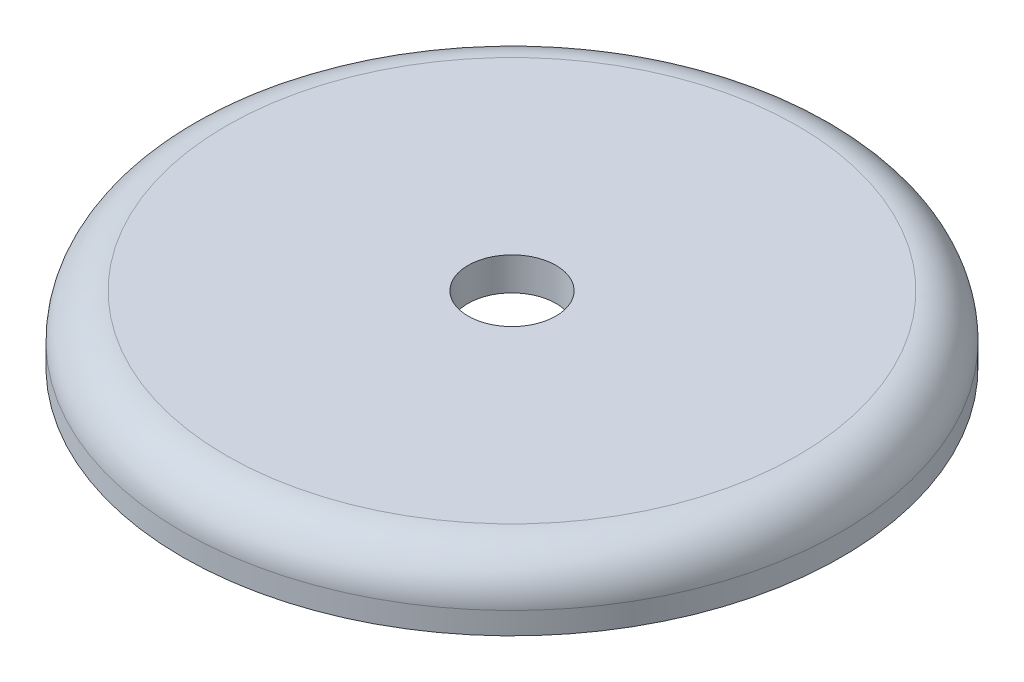
ISO-10303-21;
HEADER;
FILE_DESCRIPTION(('STEP AP214'),'2;1');
FILE_NAME('part.step','',(''),(''),'','','');
FILE_SCHEMA(('AUTOMOTIVE_DESIGN { 1 0 10303 214 1 1 1 1 }'));
ENDSEC;
DATA;
#1=APPLICATION_CONTEXT('core data for automotive mechanical design processes');
#2=APPLICATION_PROTOCOL_DEFINITION('international standard','automotive_design',2000,#1);
#3=PRODUCT_CONTEXT('',#1,'mechanical');
#4=PRODUCT('Part','Part','',(#3));
#5=PRODUCT_RELATED_PRODUCT_CATEGORY('part','',(#4));
#6=PRODUCT_DEFINITION_FORMATION('','',#4);
#7=PRODUCT_DEFINITION_CONTEXT('part definition',#1,'design');
#8=PRODUCT_DEFINITION('design','',#6,#7);
#9=PRODUCT_DEFINITION_SHAPE('','',#8);
#10=(LENGTH_UNIT() NAMED_UNIT(*) SI_UNIT(.MILLI.,.METRE.));
#11=(NAMED_UNIT(*) PLANE_ANGLE_UNIT() SI_UNIT($,.RADIAN.));
#12=(NAMED_UNIT(*) SI_UNIT($,.STERADIAN.) SOLID_ANGLE_UNIT());
#13=UNCERTAINTY_MEASURE_WITH_UNIT(LENGTH_MEASURE(1.E-05),#10,'distance_accuracy_value','');
#14=(GEOMETRIC_REPRESENTATION_CONTEXT(3) GLOBAL_UNCERTAINTY_ASSIGNED_CONTEXT((#13)) GLOBAL_UNIT_ASSIGNED_CONTEXT((#10,
#11,#12)) REPRESENTATION_CONTEXT('',''));
#15=CARTESIAN_POINT('',(0.,0.,0.));
#16=DIRECTION('',(0.,0.,1.));
#17=DIRECTION('',(1.,0.,0.));
#18=AXIS2_PLACEMENT_3D('',#15,#16,#17);
#19=CARTESIAN_POINT('',(0.,0.,0.));
#20=DIRECTION('',(0.,-1.,0.));
#21=DIRECTION('',(0.,0.,-1.));
#22=AXIS2_PLACEMENT_3D('',#19,#20,#21);
#23=PLANE('',#22);
#24=CARTESIAN_POINT('',(0.410000000000039,0.,-10.9649999974753));
#25=DIRECTION('',(0.,-1.,0.));
#26=DIRECTION('',(0.,0.,-1.));
#27=AXIS2_PLACEMENT_3D('',#24,#25,#26);
#28=CIRCLE('',#27,2.59999999999999);
#29=CARTESIAN_POINT('',(0.410000000000039,0.,-13.5649999974753));
#30=VERTEX_POINT('',#29);
#31=EDGE_CURVE('E89',#30,#30,#28,.T.);
#32=ORIENTED_EDGE('',*,*,#31,.F.);
#33=EDGE_LOOP('',(#32));
#34=FACE_BOUND('',#33,.T.);
#35=CARTESIAN_POINT('',(0.820000000000032,0.,10.9650000025247));
#36=DIRECTION('',(0.,-1.,0.));
#37=DIRECTION('',(0.,0.,-1.));
#38=AXIS2_PLACEMENT_3D('',#35,#36,#37);
#39=CIRCLE('',#38,2.6);
#40=CARTESIAN_POINT('',(0.820000000000032,0.,8.3650000025247));
#41=VERTEX_POINT('',#40);
#42=EDGE_CURVE('E81',#41,#41,#39,.T.);
#43=ORIENTED_EDGE('',*,*,#42,.F.);
#44=EDGE_LOOP('',(#43));
#45=FACE_BOUND('',#44,.T.);
#46=CARTESIAN_POINT('',(0.,0.,0.));
#47=DIRECTION('',(0.,-1.,0.));
#48=DIRECTION('',(0.,0.,-1.));
#49=AXIS2_PLACEMENT_3D('',#46,#47,#48);
#50=CIRCLE('',#49,8.);
#51=CARTESIAN_POINT('',(0.,0.,-8.));
#52=VERTEX_POINT('',#51);
#53=EDGE_CURVE('E65',#52,#52,#50,.T.);
#54=ORIENTED_EDGE('',*,*,#53,.F.);
#55=EDGE_LOOP('',(#54));
#56=FACE_BOUND('',#55,.T.);
#57=CARTESIAN_POINT('',(0.,0.,0.));
#58=DIRECTION('',(0.,-1.,0.));
#59=DIRECTION('',(0.,0.,-1.));
#60=AXIS2_PLACEMENT_3D('',#57,#58,#59);
#61=CIRCLE('',#60,15.);
#62=CARTESIAN_POINT('',(0.,0.,-15.));
#63=VERTEX_POINT('',#62);
#64=EDGE_CURVE('E56',#63,#63,#61,.T.);
#65=ORIENTED_EDGE('',*,*,#64,.T.);
#66=EDGE_LOOP('',(#65));
#67=FACE_BOUND('',#66,.T.);
#68=ADVANCED_FACE('F42',(#34,#45,#56,#67),#23,.T.);
#69=CARTESIAN_POINT('',(0.,0.,0.));
#70=DIRECTION('',(0.,-1.,0.));
#71=DIRECTION('',(0.,0.,-1.));
#72=AXIS2_PLACEMENT_3D('',#69,#70,#71);
#73=CYLINDRICAL_SURFACE('',#72,15.);
#74=CARTESIAN_POINT('',(0.,1.,0.));
#75=DIRECTION('',(0.,1.,0.));
#76=DIRECTION('',(0.,0.,1.));
#77=AXIS2_PLACEMENT_3D('',#74,#75,#76);
#78=CIRCLE('',#77,15.);
#79=CARTESIAN_POINT('',(0.,1.,15.));
#80=VERTEX_POINT('',#79);
#81=EDGE_CURVE('E50',#80,#80,#78,.F.);
#82=ORIENTED_EDGE('',*,*,#81,.T.);
#83=EDGE_LOOP('',(#82));
#84=FACE_BOUND('',#83,.T.);
#85=ORIENTED_EDGE('',*,*,#64,.F.);
#86=EDGE_LOOP('',(#85));
#87=FACE_BOUND('',#86,.T.);
#88=ADVANCED_FACE('F109',(#84,#87),#73,.T.);
#89=CARTESIAN_POINT('',(15.,3.,0.));
#90=DIRECTION('',(0.,1.,0.));
#91=DIRECTION('',(0.,0.,1.));
#92=AXIS2_PLACEMENT_3D('',#89,#90,#91);
#93=PLANE('',#92);
#94=CARTESIAN_POINT('',(0.,3.,0.));
#95=DIRECTION('',(0.,1.,0.));
#96=DIRECTION('',(0.,0.,1.));
#97=AXIS2_PLACEMENT_3D('',#94,#95,#96);
#98=CIRCLE('',#97,13.);
#99=CARTESIAN_POINT('',(0.,3.,13.));
#100=VERTEX_POINT('',#99);
#101=EDGE_CURVE('E10',#100,#100,#98,.T.);
#102=ORIENTED_EDGE('',*,*,#101,.T.);
#103=EDGE_LOOP('',(#102));
#104=FACE_BOUND('',#103,.T.);
#105=CARTESIAN_POINT('',(0.,3.,0.));
#106=DIRECTION('',(0.,1.,0.));
#107=DIRECTION('',(0.,0.,1.));
#108=AXIS2_PLACEMENT_3D('',#105,#106,#107);
#109=CIRCLE('',#108,2.);
#110=CARTESIAN_POINT('',(0.,3.,-2.00000000000009));
#111=VERTEX_POINT('',#110);
#112=EDGE_CURVE('E69',#111,#111,#109,.F.);
#113=ORIENTED_EDGE('',*,*,#112,.T.);
#114=EDGE_LOOP('',(#113));
#115=FACE_BOUND('',#114,.T.);
#116=ADVANCED_FACE('F117',(#104,#115),#93,.T.);
#117=CARTESIAN_POINT('',(0.,1.5,0.));
#118=DIRECTION('',(0.,-1.,0.));
#119=DIRECTION('',(0.,0.,-1.));
#120=AXIS2_PLACEMENT_3D('',#117,#118,#119);
#121=CYLINDRICAL_SURFACE('',#120,8.);
#122=CARTESIAN_POINT('',(0.,1.5,0.));
#123=DIRECTION('',(0.,-1.,0.));
#124=DIRECTION('',(0.,0.,-1.));
#125=AXIS2_PLACEMENT_3D('',#122,#123,#124);
#126=CIRCLE('',#125,8.);
#127=CARTESIAN_POINT('',(0.,1.5,-8.));
#128=VERTEX_POINT('',#127);
#129=EDGE_CURVE('E62',#128,#128,#126,.T.);
#130=ORIENTED_EDGE('',*,*,#129,.F.);
#131=EDGE_LOOP('',(#130));
#132=FACE_BOUND('',#131,.T.);
#133=ORIENTED_EDGE('',*,*,#53,.T.);
#134=EDGE_LOOP('',(#133));
#135=FACE_BOUND('',#134,.T.);
#136=ADVANCED_FACE('F122',(#132,#135),#121,.F.);
#137=CARTESIAN_POINT('',(0.,1.5,0.));
#138=DIRECTION('',(0.,-1.,0.));
#139=DIRECTION('',(0.,0.,-1.));
#140=AXIS2_PLACEMENT_3D('',#137,#138,#139);
#141=PLANE('',#140);
#142=CARTESIAN_POINT('',(0.,1.5,0.));
#143=DIRECTION('',(0.,-1.,0.));
#144=DIRECTION('',(0.,0.,-1.));
#145=AXIS2_PLACEMENT_3D('',#142,#143,#144);
#146=CIRCLE('',#145,2.);
#147=CARTESIAN_POINT('',(0.,1.5,-2.00000000000009));
#148=VERTEX_POINT('',#147);
#149=EDGE_CURVE('E76',#148,#148,#146,.T.);
#150=ORIENTED_EDGE('',*,*,#149,.F.);
#151=EDGE_LOOP('',(#150));
#152=FACE_BOUND('',#151,.T.);
#153=ORIENTED_EDGE('',*,*,#129,.T.);
#154=EDGE_LOOP('',(#153));
#155=FACE_BOUND('',#154,.T.);
#156=ADVANCED_FACE('F127',(#152,#155),#141,.T.);
#157=CARTESIAN_POINT('',(0.,8.65685424949239,0.));
#158=DIRECTION('',(0.,-1.,0.));
#159=DIRECTION('',(0.,0.,-1.));
#160=AXIS2_PLACEMENT_3D('',#157,#158,#159);
#161=CYLINDRICAL_SURFACE('',#160,2.);
#162=CARTESIAN_POINT('',(0.,1.5,-2.00000000000009));
#163=CARTESIAN_POINT('',(0.,1.515625,-2.00000000000009));
#164=CARTESIAN_POINT('',(0.,1.53125,-2.00000000000009));
#165=CARTESIAN_POINT('',(0.,1.5625,-2.00000000000009));
#166=CARTESIAN_POINT('',(0.,1.578125,-2.00000000000009));
#167=CARTESIAN_POINT('',(0.,1.609375,-2.00000000000009));
#168=CARTESIAN_POINT('',(0.,1.625,-2.00000000000009));
#169=CARTESIAN_POINT('',(0.,1.65625,-2.00000000000009));
#170=CARTESIAN_POINT('',(0.,1.671875,-2.00000000000009));
#171=CARTESIAN_POINT('',(0.,1.703125,-2.00000000000009));
#172=CARTESIAN_POINT('',(0.,1.71875,-2.00000000000009));
#173=CARTESIAN_POINT('',(0.,1.75,-2.00000000000009));
#174=CARTESIAN_POINT('',(0.,1.765625,-2.00000000000009));
#175=CARTESIAN_POINT('',(0.,1.796875,-2.00000000000009));
#176=CARTESIAN_POINT('',(0.,1.8125,-2.00000000000009));
#177=CARTESIAN_POINT('',(0.,1.84375,-2.00000000000009));
#178=CARTESIAN_POINT('',(0.,1.859375,-2.00000000000009));
#179=CARTESIAN_POINT('',(0.,1.890625,-2.00000000000009));
#180=CARTESIAN_POINT('',(0.,1.90625,-2.00000000000009));
#181=CARTESIAN_POINT('',(0.,1.9375,-2.00000000000009));
#182=CARTESIAN_POINT('',(0.,1.953125,-2.00000000000009));
#183=CARTESIAN_POINT('',(0.,1.984375,-2.00000000000009));
#184=CARTESIAN_POINT('',(0.,2.,-2.00000000000009));
#185=CARTESIAN_POINT('',(0.,2.03125,-2.00000000000009));
#186=CARTESIAN_POINT('',(0.,2.046875,-2.00000000000009));
#187=CARTESIAN_POINT('',(0.,2.078125,-2.00000000000009));
#188=CARTESIAN_POINT('',(0.,2.09375,-2.00000000000009));
#189=CARTESIAN_POINT('',(0.,2.125,-2.00000000000009));
#190=CARTESIAN_POINT('',(0.,2.140625,-2.00000000000009));
#191=CARTESIAN_POINT('',(0.,2.171875,-2.00000000000009));
#192=CARTESIAN_POINT('',(0.,2.1875,-2.00000000000009));
#193=CARTESIAN_POINT('',(0.,2.21875,-2.00000000000009));
#194=CARTESIAN_POINT('',(0.,2.234375,-2.00000000000009));
#195=CARTESIAN_POINT('',(0.,2.265625,-2.00000000000009));
#196=CARTESIAN_POINT('',(0.,2.28125,-2.00000000000009));
#197=CARTESIAN_POINT('',(0.,2.3125,-2.00000000000009));
#198=CARTESIAN_POINT('',(0.,2.328125,-2.00000000000009));
#199=CARTESIAN_POINT('',(0.,2.359375,-2.00000000000009));
#200=CARTESIAN_POINT('',(0.,2.375,-2.00000000000009));
#201=CARTESIAN_POINT('',(0.,2.40625,-2.00000000000009));
#202=CARTESIAN_POINT('',(0.,2.421875,-2.00000000000009));
#203=CARTESIAN_POINT('',(0.,2.453125,-2.00000000000009));
#204=CARTESIAN_POINT('',(0.,2.46875,-2.00000000000009));
#205=CARTESIAN_POINT('',(0.,2.5,-2.00000000000009));
#206=CARTESIAN_POINT('',(0.,2.515625,-2.00000000000009));
#207=CARTESIAN_POINT('',(0.,2.546875,-2.00000000000009));
#208=CARTESIAN_POINT('',(0.,2.5625,-2.00000000000009));
#209=CARTESIAN_POINT('',(0.,2.59375,-2.00000000000009));
#210=CARTESIAN_POINT('',(0.,2.609375,-2.00000000000009));
#211=CARTESIAN_POINT('',(0.,2.640625,-2.00000000000009));
#212=CARTESIAN_POINT('',(0.,2.65625,-2.00000000000009));
#213=CARTESIAN_POINT('',(0.,2.6875,-2.00000000000009));
#214=CARTESIAN_POINT('',(0.,2.703125,-2.00000000000009));
#215=CARTESIAN_POINT('',(0.,2.734375,-2.00000000000009));
#216=CARTESIAN_POINT('',(0.,2.75,-2.00000000000009));
#217=CARTESIAN_POINT('',(0.,2.78125,-2.00000000000009));
#218=CARTESIAN_POINT('',(0.,2.796875,-2.00000000000009));
#219=CARTESIAN_POINT('',(0.,2.828125,-2.00000000000009));
#220=CARTESIAN_POINT('',(0.,2.84375,-2.00000000000009));
#221=CARTESIAN_POINT('',(0.,2.875,-2.00000000000009));
#222=CARTESIAN_POINT('',(0.,2.890625,-2.00000000000009));
#223=CARTESIAN_POINT('',(0.,2.921875,-2.00000000000009));
#224=CARTESIAN_POINT('',(0.,2.9375,-2.00000000000009));
#225=CARTESIAN_POINT('',(0.,2.96875,-2.00000000000009));
#226=CARTESIAN_POINT('',(0.,2.984375,-2.00000000000009));
#227=CARTESIAN_POINT('',(0.,3.,-2.00000000000009));
#228=B_SPLINE_CURVE_WITH_KNOTS('',3,(#162,#163,#164,#165,#166,#167,#168,#169,#170,#171,#172,
#173,#174,#175,#176,#177,#178,#179,#180,#181,#182,#183,#184,#185,#186,#187,#188,#189,#190,#191,
#192,#193,#194,#195,#196,#197,#198,#199,#200,#201,#202,#203,#204,#205,#206,#207,#208,#209,#210,
#211,#212,#213,#214,#215,#216,#217,#218,#219,#220,#221,#222,#223,#224,#225,#226,#227),
.UNSPECIFIED.,.F.,.F.,(4,2,2,2,2,2,2,2,2,2,2,2,2,2,2,2,2,2,2,2,2,2,2,2,2,2,2,2,2,2,2,2,4),(0.,
0.046875,0.0937500000000001,0.140625,0.1875,0.234375,0.28125,0.328125,0.375,0.421875,0.46875,
0.515625,0.5625,0.609375,0.65625,0.703125,0.75,0.796875,0.84375,0.890625,0.9375,0.984375,
1.03125,1.078125,1.125,1.171875,1.21875,1.265625,1.3125,1.359375,1.40625,1.453125,1.5),.UNSPECIFIED.);
#229=EDGE_CURVE('BSEAM131',#148,#111,#228,.T.);
#230=ORIENTED_EDGE('',*,*,#149,.T.);
#231=ORIENTED_EDGE('',*,*,#112,.F.);
#232=ORIENTED_EDGE('',*,*,#229,.T.);
#233=ORIENTED_EDGE('',*,*,#229,.F.);
#234=EDGE_LOOP('',(#230,#232,#231,#233));
#235=FACE_BOUND('',#234,.T.);
#236=ADVANCED_FACE('F131',(#235),#161,.F.);
#237=CARTESIAN_POINT('',(0.820000000000032,1.8,10.9650000025247));
#238=DIRECTION('',(0.,-1.,0.));
#239=DIRECTION('',(0.,0.,-1.));
#240=AXIS2_PLACEMENT_3D('',#237,#238,#239);
#241=CYLINDRICAL_SURFACE('',#240,2.6);
#242=CARTESIAN_POINT('',(0.820000000000032,1.8,10.9650000025247));
#243=DIRECTION('',(0.,-1.,0.));
#244=DIRECTION('',(0.,0.,-1.));
#245=AXIS2_PLACEMENT_3D('',#242,#243,#244);
#246=CIRCLE('',#245,2.6);
#247=CARTESIAN_POINT('',(0.820000000000032,1.8,8.3650000025247));
#248=VERTEX_POINT('',#247);
#249=EDGE_CURVE('E85',#248,#248,#246,.T.);
#250=ORIENTED_EDGE('',*,*,#249,.F.);
#251=EDGE_LOOP('',(#250));
#252=FACE_BOUND('',#251,.T.);
#253=ORIENTED_EDGE('',*,*,#42,.T.);
#254=EDGE_LOOP('',(#253));
#255=FACE_BOUND('',#254,.T.);
#256=ADVANCED_FACE('F135',(#252,#255),#241,.F.);
#257=CARTESIAN_POINT('',(0.820000000000032,1.8,10.9650000025247));
#258=DIRECTION('',(0.,-1.,0.));
#259=DIRECTION('',(0.,0.,-1.));
#260=AXIS2_PLACEMENT_3D('',#257,#258,#259);
#261=PLANE('',#260);
#262=ORIENTED_EDGE('',*,*,#249,.T.);
#263=EDGE_LOOP('',(#262));
#264=FACE_BOUND('',#263,.T.);
#265=ADVANCED_FACE('F103',(#264),#261,.T.);
#266=CARTESIAN_POINT('',(0.410000000000039,1.8,-10.9649999974753));
#267=DIRECTION('',(0.,-1.,0.));
#268=DIRECTION('',(0.,0.,-1.));
#269=AXIS2_PLACEMENT_3D('',#266,#267,#268);
#270=CYLINDRICAL_SURFACE('',#269,2.59999999999999);
#271=CARTESIAN_POINT('',(0.410000000000039,1.8,-10.9649999974753));
#272=DIRECTION('',(0.,-1.,0.));
#273=DIRECTION('',(0.,0.,-1.));
#274=AXIS2_PLACEMENT_3D('',#271,#272,#273);
#275=CIRCLE('',#274,2.59999999999999);
#276=CARTESIAN_POINT('',(0.410000000000039,1.8,-13.5649999974753));
#277=VERTEX_POINT('',#276);
#278=EDGE_CURVE('E80',#277,#277,#275,.T.);
#279=ORIENTED_EDGE('',*,*,#278,.F.);
#280=EDGE_LOOP('',(#279));
#281=FACE_BOUND('',#280,.T.);
#282=ORIENTED_EDGE('',*,*,#31,.T.);
#283=EDGE_LOOP('',(#282));
#284=FACE_BOUND('',#283,.T.);
#285=ADVANCED_FACE('F100',(#281,#284),#270,.F.);
#286=CARTESIAN_POINT('',(0.410000000000039,1.8,-10.9649999974753));
#287=DIRECTION('',(0.,-1.,0.));
#288=DIRECTION('',(0.,0.,-1.));
#289=AXIS2_PLACEMENT_3D('',#286,#287,#288);
#290=PLANE('',#289);
#291=ORIENTED_EDGE('',*,*,#278,.T.);
#292=EDGE_LOOP('',(#291));
#293=FACE_BOUND('',#292,.T.);
#294=ADVANCED_FACE('F98',(#293),#290,.T.);
#295=CARTESIAN_POINT('',(0.,1.,0.));
#296=DIRECTION('',(0.,1.,0.));
#297=DIRECTION('',(0.,0.,1.));
#298=AXIS2_PLACEMENT_3D('',#295,#296,#297);
#299=TOROIDAL_SURFACE('',#298,13.,2.);
#300=ORIENTED_EDGE('',*,*,#101,.F.);
#301=EDGE_LOOP('',(#300));
#302=FACE_BOUND('',#301,.T.);
#303=ORIENTED_EDGE('',*,*,#81,.F.);
#304=EDGE_LOOP('',(#303));
#305=FACE_BOUND('',#304,.T.);
#306=ADVANCED_FACE('F44',(#302,#305),#299,.T.);
#307=CLOSED_SHELL('',(#68,#88,#116,#136,#156,#236,#256,#265,#285,#294,#306));
#308=MANIFOLD_SOLID_BREP('B2',#307);
#309=ADVANCED_BREP_SHAPE_REPRESENTATION('',(#18,#308),#14);
#310=SHAPE_DEFINITION_REPRESENTATION(#9,#309);
ENDSEC;
END-ISO-10303-21;
